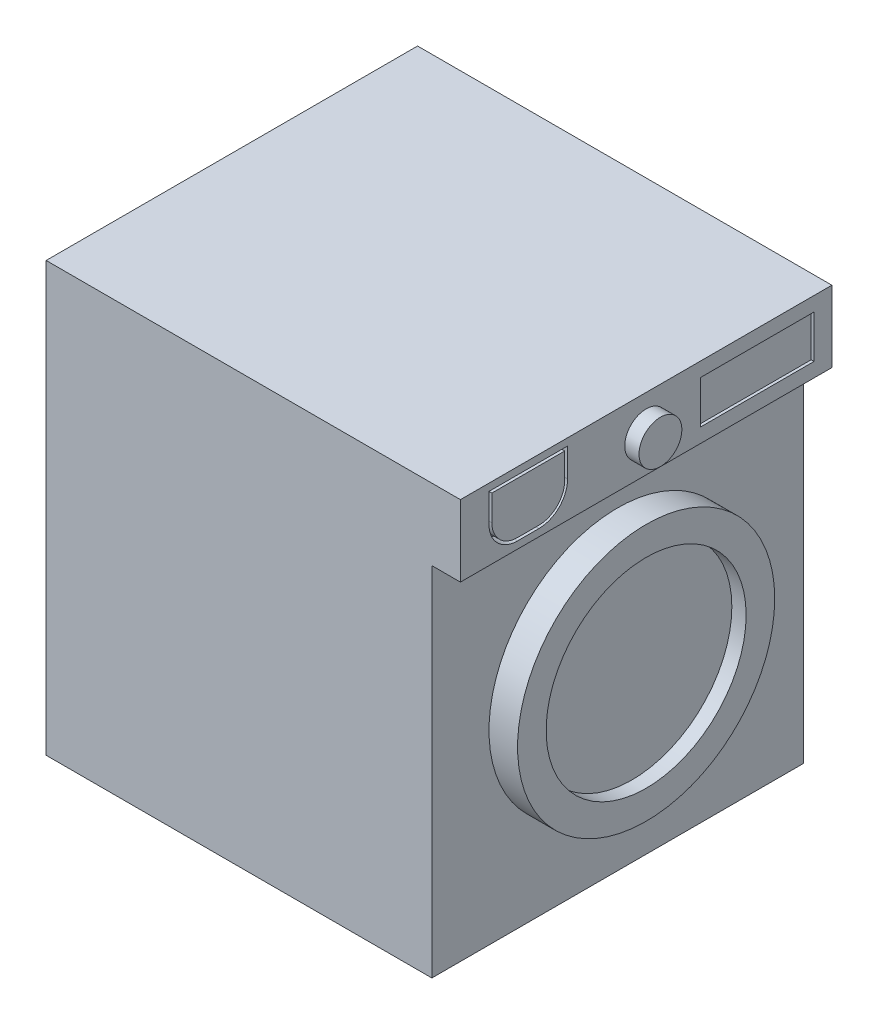
ISO-10303-21;
HEADER;
FILE_DESCRIPTION(('STEP AP214'),'2;1');
FILE_NAME('part.step','',(''),(''),'','','');
FILE_SCHEMA(('AUTOMOTIVE_DESIGN { 1 0 10303 214 1 1 1 1 }'));
ENDSEC;
DATA;
#1=APPLICATION_CONTEXT('core data for automotive mechanical design processes');
#2=APPLICATION_PROTOCOL_DEFINITION('international standard','automotive_design',2000,#1);
#3=PRODUCT_CONTEXT('',#1,'mechanical');
#4=PRODUCT('Part','Part','',(#3));
#5=PRODUCT_RELATED_PRODUCT_CATEGORY('part','',(#4));
#6=PRODUCT_DEFINITION_FORMATION('','',#4);
#7=PRODUCT_DEFINITION_CONTEXT('part definition',#1,'design');
#8=PRODUCT_DEFINITION('design','',#6,#7);
#9=PRODUCT_DEFINITION_SHAPE('','',#8);
#10=(LENGTH_UNIT() NAMED_UNIT(*) SI_UNIT(.MILLI.,.METRE.));
#11=(NAMED_UNIT(*) PLANE_ANGLE_UNIT() SI_UNIT($,.RADIAN.));
#12=(NAMED_UNIT(*) SI_UNIT($,.STERADIAN.) SOLID_ANGLE_UNIT());
#13=UNCERTAINTY_MEASURE_WITH_UNIT(LENGTH_MEASURE(1.E-05),#10,'distance_accuracy_value','');
#14=(GEOMETRIC_REPRESENTATION_CONTEXT(3) GLOBAL_UNCERTAINTY_ASSIGNED_CONTEXT((#13)) GLOBAL_UNIT_ASSIGNED_CONTEXT((#10,
#11,#12)) REPRESENTATION_CONTEXT('',''));
#15=CARTESIAN_POINT('',(0.,0.,0.));
#16=DIRECTION('',(0.,0.,1.));
#17=DIRECTION('',(1.,0.,0.));
#18=AXIS2_PLACEMENT_3D('',#15,#16,#17);
#19=CARTESIAN_POINT('',(-17.75,32.,60.));
#20=DIRECTION('',(-1.,0.,0.));
#21=DIRECTION('',(0.,0.,1.));
#22=AXIS2_PLACEMENT_3D('',#19,#20,#21);
#23=PLANE('',#22);
#24=CARTESIAN_POINT('',(-17.75,15.,47.));
#25=DIRECTION('',(1.,0.,0.));
#26=DIRECTION('',(0.,0.,-1.));
#27=AXIS2_PLACEMENT_3D('',#24,#25,#26);
#28=CIRCLE('',#27,9.);
#29=CARTESIAN_POINT('',(-17.75,15.,38.));
#30=VERTEX_POINT('',#29);
#31=EDGE_CURVE('E11',#30,#30,#28,.T.);
#32=ORIENTED_EDGE('',*,*,#31,.F.);
#33=EDGE_LOOP('',(#32));
#34=FACE_BOUND('',#33,.T.);
#35=DIRECTION('',(0.,0.,-1.));
#36=VECTOR('',#35,1.);
#37=CARTESIAN_POINT('',(-17.75,27.,60.));
#38=LINE('',#37,#36);
#39=CARTESIAN_POINT('',(-17.75,27.,60.));
#40=VERTEX_POINT('',#39);
#41=CARTESIAN_POINT('',(-17.75,27.,34.));
#42=VERTEX_POINT('',#41);
#43=EDGE_CURVE('E320',#40,#42,#38,.T.);
#44=ORIENTED_EDGE('',*,*,#43,.F.);
#45=DIRECTION('',(0.,-1.,0.));
#46=VECTOR('',#45,1.);
#47=CARTESIAN_POINT('',(-17.75,32.,60.));
#48=LINE('',#47,#46);
#49=CARTESIAN_POINT('',(-17.75,2.,60.));
#50=VERTEX_POINT('',#49);
#51=EDGE_CURVE('E372',#40,#50,#48,.T.);
#52=ORIENTED_EDGE('',*,*,#51,.T.);
#53=DIRECTION('',(0.,0.,-1.));
#54=VECTOR('',#53,1.);
#55=CARTESIAN_POINT('',(-17.75,2.,60.));
#56=LINE('',#55,#54);
#57=CARTESIAN_POINT('',(-17.75,2.,34.));
#58=VERTEX_POINT('',#57);
#59=EDGE_CURVE('E370',#50,#58,#56,.T.);
#60=ORIENTED_EDGE('',*,*,#59,.T.);
#61=DIRECTION('',(0.,-1.,0.));
#62=VECTOR('',#61,1.);
#63=CARTESIAN_POINT('',(-17.75,0.,34.));
#64=LINE('',#63,#62);
#65=EDGE_CURVE('E355',#42,#58,#64,.T.);
#66=ORIENTED_EDGE('',*,*,#65,.F.);
#67=EDGE_LOOP('',(#44,#52,#60,#66));
#68=FACE_BOUND('',#67,.T.);
#69=ADVANCED_FACE('F40',(#34,#68),#23,.F.);
#70=CARTESIAN_POINT('',(-44.75,32.,60.));
#71=DIRECTION('',(0.,0.,-1.));
#72=DIRECTION('',(-1.,0.,0.));
#73=AXIS2_PLACEMENT_3D('',#70,#71,#72);
#74=PLANE('',#73);
#75=DIRECTION('',(1.,0.,0.));
#76=VECTOR('',#75,1.);
#77=CARTESIAN_POINT('',(-44.75,2.,60.));
#78=LINE('',#77,#76);
#79=CARTESIAN_POINT('',(-44.75,2.,60.));
#80=VERTEX_POINT('',#79);
#81=EDGE_CURVE('E374',#80,#50,#78,.T.);
#82=ORIENTED_EDGE('',*,*,#81,.T.);
#83=ORIENTED_EDGE('',*,*,#51,.F.);
#84=DIRECTION('',(-1.,0.,0.));
#85=VECTOR('',#84,1.);
#86=CARTESIAN_POINT('',(-15.75,27.,60.));
#87=LINE('',#86,#85);
#88=CARTESIAN_POINT('',(-15.75,27.,60.));
#89=VERTEX_POINT('',#88);
#90=EDGE_CURVE('E345',#89,#40,#87,.T.);
#91=ORIENTED_EDGE('',*,*,#90,.F.);
#92=DIRECTION('',(0.,-1.,0.));
#93=VECTOR('',#92,1.);
#94=CARTESIAN_POINT('',(-15.75,32.,60.));
#95=LINE('',#94,#93);
#96=CARTESIAN_POINT('',(-15.75,32.,60.));
#97=VERTEX_POINT('',#96);
#98=EDGE_CURVE('E330',#97,#89,#95,.T.);
#99=ORIENTED_EDGE('',*,*,#98,.F.);
#100=DIRECTION('',(1.,0.,0.));
#101=VECTOR('',#100,1.);
#102=CARTESIAN_POINT('',(-44.75,32.,60.));
#103=LINE('',#102,#101);
#104=CARTESIAN_POINT('',(-44.75,32.,60.));
#105=VERTEX_POINT('',#104);
#106=EDGE_CURVE('E369',#105,#97,#103,.T.);
#107=ORIENTED_EDGE('',*,*,#106,.F.);
#108=DIRECTION('',(0.,-1.,0.));
#109=VECTOR('',#108,1.);
#110=CARTESIAN_POINT('',(-44.75,32.,60.));
#111=LINE('',#110,#109);
#112=EDGE_CURVE('E44',#105,#80,#111,.T.);
#113=ORIENTED_EDGE('',*,*,#112,.T.);
#114=EDGE_LOOP('',(#82,#83,#91,#99,#107,#113));
#115=FACE_BOUND('',#114,.T.);
#116=ADVANCED_FACE('F385',(#115),#74,.F.);
#117=CARTESIAN_POINT('',(0.,32.,0.));
#118=DIRECTION('',(0.,-1.,0.));
#119=DIRECTION('',(0.,0.,-1.));
#120=AXIS2_PLACEMENT_3D('',#117,#118,#119);
#121=PLANE('',#120);
#122=ORIENTED_EDGE('',*,*,#106,.T.);
#123=DIRECTION('',(0.,0.,1.));
#124=VECTOR('',#123,1.);
#125=CARTESIAN_POINT('',(-15.75,32.,60.));
#126=LINE('',#125,#124);
#127=CARTESIAN_POINT('',(-15.75,32.,34.));
#128=VERTEX_POINT('',#127);
#129=EDGE_CURVE('E338',#128,#97,#126,.T.);
#130=ORIENTED_EDGE('',*,*,#129,.F.);
#131=DIRECTION('',(1.,0.,0.));
#132=VECTOR('',#131,1.);
#133=CARTESIAN_POINT('',(-74.754166377355,32.,34.));
#134=LINE('',#133,#132);
#135=CARTESIAN_POINT('',(-44.75,32.,34.));
#136=VERTEX_POINT('',#135);
#137=EDGE_CURVE('E358',#136,#128,#134,.T.);
#138=ORIENTED_EDGE('',*,*,#137,.F.);
#139=DIRECTION('',(0.,0.,1.));
#140=VECTOR('',#139,1.);
#141=CARTESIAN_POINT('',(-44.75,32.,60.));
#142=LINE('',#141,#140);
#143=EDGE_CURVE('E367',#136,#105,#142,.T.);
#144=ORIENTED_EDGE('',*,*,#143,.T.);
#145=EDGE_LOOP('',(#122,#130,#138,#144));
#146=FACE_BOUND('',#145,.T.);
#147=ADVANCED_FACE('F407',(#146),#121,.F.);
#148=CARTESIAN_POINT('',(0.,2.,0.));
#149=DIRECTION('',(0.,-1.,0.));
#150=DIRECTION('',(0.,0.,-1.));
#151=AXIS2_PLACEMENT_3D('',#148,#149,#150);
#152=PLANE('',#151);
#153=DIRECTION('',(1.,0.,0.));
#154=VECTOR('',#153,1.);
#155=CARTESIAN_POINT('',(-74.754166377355,2.,34.));
#156=LINE('',#155,#154);
#157=CARTESIAN_POINT('',(-44.75,2.,34.));
#158=VERTEX_POINT('',#157);
#159=EDGE_CURVE('E362',#158,#58,#156,.T.);
#160=ORIENTED_EDGE('',*,*,#159,.T.);
#161=ORIENTED_EDGE('',*,*,#59,.F.);
#162=ORIENTED_EDGE('',*,*,#81,.F.);
#163=DIRECTION('',(0.,0.,1.));
#164=VECTOR('',#163,1.);
#165=CARTESIAN_POINT('',(-44.75,2.,60.));
#166=LINE('',#165,#164);
#167=EDGE_CURVE('E365',#158,#80,#166,.T.);
#168=ORIENTED_EDGE('',*,*,#167,.F.);
#169=EDGE_LOOP('',(#160,#161,#162,#168));
#170=FACE_BOUND('',#169,.T.);
#171=ADVANCED_FACE('F393',(#170),#152,.T.);
#172=CARTESIAN_POINT('',(-44.75,32.,60.));
#173=DIRECTION('',(1.,0.,0.));
#174=DIRECTION('',(0.,0.,-1.));
#175=AXIS2_PLACEMENT_3D('',#172,#173,#174);
#176=PLANE('',#175);
#177=ORIENTED_EDGE('',*,*,#143,.F.);
#178=DIRECTION('',(0.,-1.,0.));
#179=VECTOR('',#178,1.);
#180=CARTESIAN_POINT('',(-44.75,0.,34.));
#181=LINE('',#180,#179);
#182=EDGE_CURVE('E359',#136,#158,#181,.T.);
#183=ORIENTED_EDGE('',*,*,#182,.T.);
#184=ORIENTED_EDGE('',*,*,#167,.T.);
#185=ORIENTED_EDGE('',*,*,#112,.F.);
#186=EDGE_LOOP('',(#177,#183,#184,#185));
#187=FACE_BOUND('',#186,.T.);
#188=ADVANCED_FACE('F42',(#187),#176,.F.);
#189=CARTESIAN_POINT('',(-74.754166377355,0.,34.));
#190=DIRECTION('',(0.,0.,1.));
#191=DIRECTION('',(1.,0.,0.));
#192=AXIS2_PLACEMENT_3D('',#189,#190,#191);
#193=PLANE('',#192);
#194=ORIENTED_EDGE('',*,*,#137,.T.);
#195=DIRECTION('',(0.,1.,0.));
#196=VECTOR('',#195,1.);
#197=CARTESIAN_POINT('',(-15.75,32.,34.));
#198=LINE('',#197,#196);
#199=CARTESIAN_POINT('',(-15.75,27.,34.));
#200=VERTEX_POINT('',#199);
#201=EDGE_CURVE('E335',#200,#128,#198,.T.);
#202=ORIENTED_EDGE('',*,*,#201,.F.);
#203=DIRECTION('',(-1.,0.,0.));
#204=VECTOR('',#203,1.);
#205=CARTESIAN_POINT('',(-15.75,27.,34.));
#206=LINE('',#205,#204);
#207=EDGE_CURVE('E341',#200,#42,#206,.T.);
#208=ORIENTED_EDGE('',*,*,#207,.T.);
#209=ORIENTED_EDGE('',*,*,#65,.T.);
#210=ORIENTED_EDGE('',*,*,#159,.F.);
#211=ORIENTED_EDGE('',*,*,#182,.F.);
#212=EDGE_LOOP('',(#194,#202,#208,#209,#210,#211));
#213=FACE_BOUND('',#212,.T.);
#214=ADVANCED_FACE('F396',(#213),#193,.F.);
#215=CARTESIAN_POINT('',(-15.75,15.,47.));
#216=DIRECTION('',(-1.,0.,0.));
#217=DIRECTION('',(0.,0.,1.));
#218=AXIS2_PLACEMENT_3D('',#215,#216,#217);
#219=CYLINDRICAL_SURFACE('',#218,9.);
#220=CARTESIAN_POINT('',(-15.75,15.,47.));
#221=DIRECTION('',(1.,0.,0.));
#222=DIRECTION('',(0.,0.,-1.));
#223=AXIS2_PLACEMENT_3D('',#220,#221,#222);
#224=CIRCLE('',#223,9.);
#225=CARTESIAN_POINT('',(-15.75,15.,38.));
#226=VERTEX_POINT('',#225);
#227=EDGE_CURVE('E351',#226,#226,#224,.T.);
#228=ORIENTED_EDGE('',*,*,#227,.F.);
#229=EDGE_LOOP('',(#228));
#230=FACE_BOUND('',#229,.T.);
#231=ORIENTED_EDGE('',*,*,#31,.T.);
#232=EDGE_LOOP('',(#231));
#233=FACE_BOUND('',#232,.T.);
#234=ADVANCED_FACE('F423',(#230,#233),#219,.T.);
#235=CARTESIAN_POINT('',(-15.75,15.,47.));
#236=DIRECTION('',(1.,0.,0.));
#237=DIRECTION('',(0.,0.,-1.));
#238=AXIS2_PLACEMENT_3D('',#235,#236,#237);
#239=PLANE('',#238);
#240=CARTESIAN_POINT('',(-15.75,15.,47.));
#241=DIRECTION('',(1.,0.,0.));
#242=DIRECTION('',(0.,0.,-1.));
#243=AXIS2_PLACEMENT_3D('',#240,#241,#242);
#244=CIRCLE('',#243,7.);
#245=CARTESIAN_POINT('',(-15.75,15.,40.));
#246=VERTEX_POINT('',#245);
#247=EDGE_CURVE('E347',#246,#246,#244,.T.);
#248=ORIENTED_EDGE('',*,*,#247,.F.);
#249=EDGE_LOOP('',(#248));
#250=FACE_BOUND('',#249,.T.);
#251=ORIENTED_EDGE('',*,*,#227,.T.);
#252=EDGE_LOOP('',(#251));
#253=FACE_BOUND('',#252,.T.);
#254=ADVANCED_FACE('F425',(#250,#253),#239,.T.);
#255=CARTESIAN_POINT('',(-16.75,15.,47.));
#256=DIRECTION('',(1.,0.,0.));
#257=DIRECTION('',(0.,0.,-1.));
#258=AXIS2_PLACEMENT_3D('',#255,#256,#257);
#259=CYLINDRICAL_SURFACE('',#258,7.);
#260=CARTESIAN_POINT('',(-16.75,15.,47.));
#261=DIRECTION('',(1.,0.,0.));
#262=DIRECTION('',(0.,0.,-1.));
#263=AXIS2_PLACEMENT_3D('',#260,#261,#262);
#264=CIRCLE('',#263,7.);
#265=CARTESIAN_POINT('',(-16.75,15.,40.));
#266=VERTEX_POINT('',#265);
#267=EDGE_CURVE('E348',#266,#266,#264,.T.);
#268=ORIENTED_EDGE('',*,*,#267,.F.);
#269=EDGE_LOOP('',(#268));
#270=FACE_BOUND('',#269,.T.);
#271=ORIENTED_EDGE('',*,*,#247,.T.);
#272=EDGE_LOOP('',(#271));
#273=FACE_BOUND('',#272,.T.);
#274=ADVANCED_FACE('F432',(#270,#273),#259,.F.);
#275=CARTESIAN_POINT('',(-16.75,15.,47.));
#276=DIRECTION('',(1.,0.,0.));
#277=DIRECTION('',(0.,0.,-1.));
#278=AXIS2_PLACEMENT_3D('',#275,#276,#277);
#279=PLANE('',#278);
#280=ORIENTED_EDGE('',*,*,#267,.T.);
#281=EDGE_LOOP('',(#280));
#282=FACE_BOUND('',#281,.T.);
#283=ADVANCED_FACE('F439',(#282),#279,.T.);
#284=CARTESIAN_POINT('',(-15.75,27.,60.));
#285=DIRECTION('',(0.,1.,0.));
#286=DIRECTION('',(0.,0.,1.));
#287=AXIS2_PLACEMENT_3D('',#284,#285,#286);
#288=PLANE('',#287);
#289=ORIENTED_EDGE('',*,*,#43,.T.);
#290=ORIENTED_EDGE('',*,*,#207,.F.);
#291=DIRECTION('',(0.,0.,-1.));
#292=VECTOR('',#291,1.);
#293=CARTESIAN_POINT('',(-15.75,27.,60.));
#294=LINE('',#293,#292);
#295=EDGE_CURVE('E333',#89,#200,#294,.T.);
#296=ORIENTED_EDGE('',*,*,#295,.F.);
#297=ORIENTED_EDGE('',*,*,#90,.T.);
#298=EDGE_LOOP('',(#289,#290,#296,#297));
#299=FACE_BOUND('',#298,.T.);
#300=ADVANCED_FACE('F400',(#299),#288,.F.);
#301=CARTESIAN_POINT('',(-15.75,0.,0.));
#302=DIRECTION('',(1.,0.,0.));
#303=DIRECTION('',(0.,0.,-1.));
#304=AXIS2_PLACEMENT_3D('',#301,#302,#303);
#305=PLANE('',#304);
#306=DIRECTION('',(0.,-1.,0.));
#307=VECTOR('',#306,1.);
#308=CARTESIAN_POINT('',(-15.75,31.,43.1972781766812));
#309=LINE('',#308,#307);
#310=CARTESIAN_POINT('',(-15.75,31.,43.1972781766812));
#311=VERTEX_POINT('',#310);
#312=CARTESIAN_POINT('',(-15.75,28.,43.1972781766812));
#313=VERTEX_POINT('',#312);
#314=EDGE_CURVE('E56',#311,#313,#309,.T.);
#315=ORIENTED_EDGE('',*,*,#314,.F.);
#316=DIRECTION('',(0.,0.,1.));
#317=VECTOR('',#316,1.);
#318=CARTESIAN_POINT('',(-15.75,31.,43.1972781766812));
#319=LINE('',#318,#317);
#320=CARTESIAN_POINT('',(-15.75,31.,35.2483630656139));
#321=VERTEX_POINT('',#320);
#322=EDGE_CURVE('E210',#321,#311,#319,.T.);
#323=ORIENTED_EDGE('',*,*,#322,.F.);
#324=DIRECTION('',(0.,1.,0.));
#325=VECTOR('',#324,1.);
#326=CARTESIAN_POINT('',(-15.75,31.,35.2483630656139));
#327=LINE('',#326,#325);
#328=CARTESIAN_POINT('',(-15.75,28.,35.2483630656139));
#329=VERTEX_POINT('',#328);
#330=EDGE_CURVE('E213',#329,#321,#327,.T.);
#331=ORIENTED_EDGE('',*,*,#330,.F.);
#332=DIRECTION('',(0.,0.,-1.));
#333=VECTOR('',#332,1.);
#334=CARTESIAN_POINT('',(-15.75,28.,43.1972781766812));
#335=LINE('',#334,#333);
#336=EDGE_CURVE('E219',#313,#329,#335,.T.);
#337=ORIENTED_EDGE('',*,*,#336,.F.);
#338=EDGE_LOOP('',(#315,#323,#331,#337));
#339=FACE_BOUND('',#338,.T.);
#340=CARTESIAN_POINT('',(-15.75,29.5,47.));
#341=DIRECTION('',(1.,0.,0.));
#342=DIRECTION('',(0.,0.,-1.));
#343=AXIS2_PLACEMENT_3D('',#340,#341,#342);
#344=CIRCLE('',#343,1.5);
#345=CARTESIAN_POINT('',(-15.75,29.5,45.5));
#346=VERTEX_POINT('',#345);
#347=EDGE_CURVE('E225',#346,#346,#344,.T.);
#348=ORIENTED_EDGE('',*,*,#347,.F.);
#349=EDGE_LOOP('',(#348));
#350=FACE_BOUND('',#349,.T.);
#351=DIRECTION('',(0.,-1.,0.));
#352=VECTOR('',#351,1.);
#353=CARTESIAN_POINT('',(-15.75,31.5,58.));
#354=LINE('',#353,#352);
#355=CARTESIAN_POINT('',(-15.75,31.5,58.));
#356=VERTEX_POINT('',#355);
#357=CARTESIAN_POINT('',(-15.75,29.5,58.));
#358=VERTEX_POINT('',#357);
#359=EDGE_CURVE('E64',#356,#358,#354,.T.);
#360=ORIENTED_EDGE('',*,*,#359,.F.);
#361=DIRECTION('',(0.,0.,1.));
#362=VECTOR('',#361,1.);
#363=CARTESIAN_POINT('',(-15.75,31.5,58.));
#364=LINE('',#363,#362);
#365=CARTESIAN_POINT('',(-15.75,31.5,52.5));
#366=VERTEX_POINT('',#365);
#367=EDGE_CURVE('E287',#366,#356,#364,.T.);
#368=ORIENTED_EDGE('',*,*,#367,.F.);
#369=DIRECTION('',(0.,1.,0.));
#370=VECTOR('',#369,1.);
#371=CARTESIAN_POINT('',(-15.75,31.5,52.5));
#372=LINE('',#371,#370);
#373=CARTESIAN_POINT('',(-15.75,29.5,52.5));
#374=VERTEX_POINT('',#373);
#375=EDGE_CURVE('E313',#374,#366,#372,.T.);
#376=ORIENTED_EDGE('',*,*,#375,.F.);
#377=CARTESIAN_POINT('',(-15.75,29.5,54.5));
#378=DIRECTION('',(1.,0.,0.));
#379=DIRECTION('',(0.,0.,-1.));
#380=AXIS2_PLACEMENT_3D('',#377,#378,#379);
#381=CIRCLE('',#380,2.);
#382=CARTESIAN_POINT('',(-15.75,27.5,54.5));
#383=VERTEX_POINT('',#382);
#384=EDGE_CURVE('E310',#383,#374,#381,.T.);
#385=ORIENTED_EDGE('',*,*,#384,.F.);
#386=DIRECTION('',(0.,0.,-1.));
#387=VECTOR('',#386,1.);
#388=CARTESIAN_POINT('',(-15.75,27.5,56.));
#389=LINE('',#388,#387);
#390=CARTESIAN_POINT('',(-15.75,27.5,56.));
#391=VERTEX_POINT('',#390);
#392=EDGE_CURVE('E307',#391,#383,#389,.T.);
#393=ORIENTED_EDGE('',*,*,#392,.F.);
#394=CARTESIAN_POINT('',(-15.75,29.5,56.));
#395=DIRECTION('',(1.,0.,0.));
#396=DIRECTION('',(0.,0.,1.));
#397=AXIS2_PLACEMENT_3D('',#394,#395,#396);
#398=CIRCLE('',#397,2.);
#399=EDGE_CURVE('E304',#358,#391,#398,.T.);
#400=ORIENTED_EDGE('',*,*,#399,.F.);
#401=EDGE_LOOP('',(#360,#368,#376,#385,#393,#400));
#402=FACE_BOUND('',#401,.T.);
#403=ORIENTED_EDGE('',*,*,#98,.T.);
#404=ORIENTED_EDGE('',*,*,#295,.T.);
#405=ORIENTED_EDGE('',*,*,#201,.T.);
#406=ORIENTED_EDGE('',*,*,#129,.T.);
#407=EDGE_LOOP('',(#403,#404,#405,#406));
#408=FACE_BOUND('',#407,.T.);
#409=ADVANCED_FACE('F403',(#339,#350,#402,#408),#305,.T.);
#410=CARTESIAN_POINT('',(-16.75,31.5,58.));
#411=DIRECTION('',(0.,0.,1.));
#412=DIRECTION('',(1.,0.,0.));
#413=AXIS2_PLACEMENT_3D('',#410,#411,#412);
#414=PLANE('',#413);
#415=ORIENTED_EDGE('',*,*,#359,.T.);
#416=DIRECTION('',(1.,0.,0.));
#417=VECTOR('',#416,1.);
#418=CARTESIAN_POINT('',(-16.75,29.5,58.));
#419=LINE('',#418,#417);
#420=CARTESIAN_POINT('',(-16.75,29.5,58.));
#421=VERTEX_POINT('',#420);
#422=EDGE_CURVE('E302',#421,#358,#419,.T.);
#423=ORIENTED_EDGE('',*,*,#422,.F.);
#424=DIRECTION('',(0.,-1.,0.));
#425=VECTOR('',#424,1.);
#426=CARTESIAN_POINT('',(-16.75,31.5,58.));
#427=LINE('',#426,#425);
#428=CARTESIAN_POINT('',(-16.75,31.5,58.));
#429=VERTEX_POINT('',#428);
#430=EDGE_CURVE('E283',#429,#421,#427,.T.);
#431=ORIENTED_EDGE('',*,*,#430,.F.);
#432=DIRECTION('',(1.,0.,0.));
#433=VECTOR('',#432,1.);
#434=CARTESIAN_POINT('',(-16.75,31.5,58.));
#435=LINE('',#434,#433);
#436=EDGE_CURVE('E318',#429,#356,#435,.T.);
#437=ORIENTED_EDGE('',*,*,#436,.T.);
#438=EDGE_LOOP('',(#415,#423,#431,#437));
#439=FACE_BOUND('',#438,.T.);
#440=ADVANCED_FACE('F448',(#439),#414,.F.);
#441=CARTESIAN_POINT('',(-16.75,31.5,58.));
#442=DIRECTION('',(0.,1.,0.));
#443=DIRECTION('',(0.,0.,1.));
#444=AXIS2_PLACEMENT_3D('',#441,#442,#443);
#445=PLANE('',#444);
#446=ORIENTED_EDGE('',*,*,#367,.T.);
#447=ORIENTED_EDGE('',*,*,#436,.F.);
#448=DIRECTION('',(0.,0.,1.));
#449=VECTOR('',#448,1.);
#450=CARTESIAN_POINT('',(-16.75,31.5,58.));
#451=LINE('',#450,#449);
#452=CARTESIAN_POINT('',(-16.75,31.5,52.5));
#453=VERTEX_POINT('',#452);
#454=EDGE_CURVE('E299',#453,#429,#451,.T.);
#455=ORIENTED_EDGE('',*,*,#454,.F.);
#456=DIRECTION('',(1.,0.,0.));
#457=VECTOR('',#456,1.);
#458=CARTESIAN_POINT('',(-16.75,31.5,52.5));
#459=LINE('',#458,#457);
#460=EDGE_CURVE('E321',#453,#366,#459,.T.);
#461=ORIENTED_EDGE('',*,*,#460,.T.);
#462=EDGE_LOOP('',(#446,#447,#455,#461));
#463=FACE_BOUND('',#462,.T.);
#464=ADVANCED_FACE('F453',(#463),#445,.F.);
#465=CARTESIAN_POINT('',(-16.75,31.5,52.5));
#466=DIRECTION('',(0.,0.,-1.));
#467=DIRECTION('',(0.,1.,0.));
#468=AXIS2_PLACEMENT_3D('',#465,#466,#467);
#469=PLANE('',#468);
#470=ORIENTED_EDGE('',*,*,#375,.T.);
#471=ORIENTED_EDGE('',*,*,#460,.F.);
#472=DIRECTION('',(0.,1.,0.));
#473=VECTOR('',#472,1.);
#474=CARTESIAN_POINT('',(-16.75,31.5,52.5));
#475=LINE('',#474,#473);
#476=CARTESIAN_POINT('',(-16.75,29.5,52.5));
#477=VERTEX_POINT('',#476);
#478=EDGE_CURVE('E296',#477,#453,#475,.T.);
#479=ORIENTED_EDGE('',*,*,#478,.F.);
#480=DIRECTION('',(1.,0.,0.));
#481=VECTOR('',#480,1.);
#482=CARTESIAN_POINT('',(-16.75,29.5,52.5));
#483=LINE('',#482,#481);
#484=EDGE_CURVE('E323',#477,#374,#483,.T.);
#485=ORIENTED_EDGE('',*,*,#484,.T.);
#486=EDGE_LOOP('',(#470,#471,#479,#485));
#487=FACE_BOUND('',#486,.T.);
#488=ADVANCED_FACE('F466',(#487),#469,.F.);
#489=CARTESIAN_POINT('',(-16.75,29.5,54.5));
#490=DIRECTION('',(1.,0.,0.));
#491=DIRECTION('',(0.,0.,-1.));
#492=AXIS2_PLACEMENT_3D('',#489,#490,#491);
#493=CYLINDRICAL_SURFACE('',#492,2.);
#494=ORIENTED_EDGE('',*,*,#384,.T.);
#495=ORIENTED_EDGE('',*,*,#484,.F.);
#496=CARTESIAN_POINT('',(-16.75,29.5,54.5));
#497=DIRECTION('',(1.,0.,0.));
#498=DIRECTION('',(0.,0.,-1.));
#499=AXIS2_PLACEMENT_3D('',#496,#497,#498);
#500=CIRCLE('',#499,2.);
#501=CARTESIAN_POINT('',(-16.75,27.5,54.5));
#502=VERTEX_POINT('',#501);
#503=EDGE_CURVE('E293',#502,#477,#500,.T.);
#504=ORIENTED_EDGE('',*,*,#503,.F.);
#505=DIRECTION('',(1.,0.,0.));
#506=VECTOR('',#505,1.);
#507=CARTESIAN_POINT('',(-16.75,27.5,54.5));
#508=LINE('',#507,#506);
#509=EDGE_CURVE('E325',#502,#383,#508,.T.);
#510=ORIENTED_EDGE('',*,*,#509,.T.);
#511=EDGE_LOOP('',(#494,#495,#504,#510));
#512=FACE_BOUND('',#511,.T.);
#513=ADVANCED_FACE('F462',(#512),#493,.F.);
#514=CARTESIAN_POINT('',(-16.75,27.5,56.));
#515=DIRECTION('',(0.,-1.,0.));
#516=DIRECTION('',(0.,0.,-1.));
#517=AXIS2_PLACEMENT_3D('',#514,#515,#516);
#518=PLANE('',#517);
#519=ORIENTED_EDGE('',*,*,#392,.T.);
#520=ORIENTED_EDGE('',*,*,#509,.F.);
#521=DIRECTION('',(0.,0.,-1.));
#522=VECTOR('',#521,1.);
#523=CARTESIAN_POINT('',(-16.75,27.5,56.));
#524=LINE('',#523,#522);
#525=CARTESIAN_POINT('',(-16.75,27.5,56.));
#526=VERTEX_POINT('',#525);
#527=EDGE_CURVE('E290',#526,#502,#524,.T.);
#528=ORIENTED_EDGE('',*,*,#527,.F.);
#529=DIRECTION('',(1.,0.,0.));
#530=VECTOR('',#529,1.);
#531=CARTESIAN_POINT('',(-16.75,27.5,56.));
#532=LINE('',#531,#530);
#533=EDGE_CURVE('E327',#526,#391,#532,.T.);
#534=ORIENTED_EDGE('',*,*,#533,.T.);
#535=EDGE_LOOP('',(#519,#520,#528,#534));
#536=FACE_BOUND('',#535,.T.);
#537=ADVANCED_FACE('F458',(#536),#518,.F.);
#538=CARTESIAN_POINT('',(-16.75,29.5,56.));
#539=DIRECTION('',(1.,0.,0.));
#540=DIRECTION('',(0.,0.,-1.));
#541=AXIS2_PLACEMENT_3D('',#538,#539,#540);
#542=CYLINDRICAL_SURFACE('',#541,2.);
#543=ORIENTED_EDGE('',*,*,#399,.T.);
#544=ORIENTED_EDGE('',*,*,#533,.F.);
#545=CARTESIAN_POINT('',(-16.75,29.5,56.));
#546=DIRECTION('',(1.,0.,0.));
#547=DIRECTION('',(0.,0.,1.));
#548=AXIS2_PLACEMENT_3D('',#545,#546,#547);
#549=CIRCLE('',#548,2.);
#550=EDGE_CURVE('E286',#421,#526,#549,.T.);
#551=ORIENTED_EDGE('',*,*,#550,.F.);
#552=ORIENTED_EDGE('',*,*,#422,.T.);
#553=EDGE_LOOP('',(#543,#544,#551,#552));
#554=FACE_BOUND('',#553,.T.);
#555=ADVANCED_FACE('F454',(#554),#542,.F.);
#556=CARTESIAN_POINT('',(-16.75,29.5,56.));
#557=DIRECTION('',(-1.,0.,0.));
#558=DIRECTION('',(0.,0.,1.));
#559=AXIS2_PLACEMENT_3D('',#556,#557,#558);
#560=PLANE('',#559);
#561=DIRECTION('',(0.,-1.,0.));
#562=VECTOR('',#561,1.);
#563=CARTESIAN_POINT('',(-16.75,31.3,57.8));
#564=LINE('',#563,#562);
#565=CARTESIAN_POINT('',(-16.75,31.3,57.8));
#566=VERTEX_POINT('',#565);
#567=CARTESIAN_POINT('',(-16.75,29.5,57.8));
#568=VERTEX_POINT('',#567);
#569=EDGE_CURVE('E235',#566,#568,#564,.T.);
#570=ORIENTED_EDGE('',*,*,#569,.F.);
#571=DIRECTION('',(0.,0.,1.));
#572=VECTOR('',#571,1.);
#573=CARTESIAN_POINT('',(-16.75,31.3,57.8));
#574=LINE('',#573,#572);
#575=CARTESIAN_POINT('',(-16.75,31.3,52.7));
#576=VERTEX_POINT('',#575);
#577=EDGE_CURVE('E251',#576,#566,#574,.T.);
#578=ORIENTED_EDGE('',*,*,#577,.F.);
#579=DIRECTION('',(0.,1.,0.));
#580=VECTOR('',#579,1.);
#581=CARTESIAN_POINT('',(-16.75,31.3,52.7));
#582=LINE('',#581,#580);
#583=CARTESIAN_POINT('',(-16.75,29.5,52.7));
#584=VERTEX_POINT('',#583);
#585=EDGE_CURVE('E248',#584,#576,#582,.T.);
#586=ORIENTED_EDGE('',*,*,#585,.F.);
#587=CARTESIAN_POINT('',(-16.75,29.5,54.5));
#588=DIRECTION('',(1.,0.,0.));
#589=DIRECTION('',(0.,0.,-1.));
#590=AXIS2_PLACEMENT_3D('',#587,#588,#589);
#591=CIRCLE('',#590,1.8);
#592=CARTESIAN_POINT('',(-16.75,27.7,54.5));
#593=VERTEX_POINT('',#592);
#594=EDGE_CURVE('E245',#593,#584,#591,.T.);
#595=ORIENTED_EDGE('',*,*,#594,.F.);
#596=DIRECTION('',(0.,0.,-1.));
#597=VECTOR('',#596,1.);
#598=CARTESIAN_POINT('',(-16.75,27.7,56.));
#599=LINE('',#598,#597);
#600=CARTESIAN_POINT('',(-16.75,27.7,56.));
#601=VERTEX_POINT('',#600);
#602=EDGE_CURVE('E242',#601,#593,#599,.T.);
#603=ORIENTED_EDGE('',*,*,#602,.F.);
#604=CARTESIAN_POINT('',(-16.75,29.5,56.));
#605=DIRECTION('',(1.,0.,0.));
#606=DIRECTION('',(0.,0.,1.));
#607=AXIS2_PLACEMENT_3D('',#604,#605,#606);
#608=CIRCLE('',#607,1.8);
#609=EDGE_CURVE('E238',#568,#601,#608,.T.);
#610=ORIENTED_EDGE('',*,*,#609,.F.);
#611=EDGE_LOOP('',(#570,#578,#586,#595,#603,#610));
#612=FACE_BOUND('',#611,.T.);
#613=ORIENTED_EDGE('',*,*,#430,.T.);
#614=ORIENTED_EDGE('',*,*,#550,.T.);
#615=ORIENTED_EDGE('',*,*,#527,.T.);
#616=ORIENTED_EDGE('',*,*,#503,.T.);
#617=ORIENTED_EDGE('',*,*,#478,.T.);
#618=ORIENTED_EDGE('',*,*,#454,.T.);
#619=EDGE_LOOP('',(#613,#614,#615,#616,#617,#618));
#620=FACE_BOUND('',#619,.T.);
#621=ADVANCED_FACE('F457',(#612,#620),#560,.F.);
#622=CARTESIAN_POINT('',(-16.75,31.3,57.8));
#623=DIRECTION('',(0.,0.,1.));
#624=DIRECTION('',(1.,0.,0.));
#625=AXIS2_PLACEMENT_3D('',#622,#623,#624);
#626=PLANE('',#625);
#627=DIRECTION('',(0.,-1.,0.));
#628=VECTOR('',#627,1.);
#629=CARTESIAN_POINT('',(-15.75,31.3,57.8));
#630=LINE('',#629,#628);
#631=CARTESIAN_POINT('',(-15.75,31.3,57.8));
#632=VERTEX_POINT('',#631);
#633=CARTESIAN_POINT('',(-15.75,29.5,57.8));
#634=VERTEX_POINT('',#633);
#635=EDGE_CURVE('E232',#632,#634,#630,.T.);
#636=ORIENTED_EDGE('',*,*,#635,.F.);
#637=DIRECTION('',(1.,0.,0.));
#638=VECTOR('',#637,1.);
#639=CARTESIAN_POINT('',(-16.75,31.3,57.8));
#640=LINE('',#639,#638);
#641=EDGE_CURVE('E271',#566,#632,#640,.T.);
#642=ORIENTED_EDGE('',*,*,#641,.F.);
#643=ORIENTED_EDGE('',*,*,#569,.T.);
#644=DIRECTION('',(1.,0.,0.));
#645=VECTOR('',#644,1.);
#646=CARTESIAN_POINT('',(-16.75,29.5,57.8));
#647=LINE('',#646,#645);
#648=EDGE_CURVE('E254',#568,#634,#647,.T.);
#649=ORIENTED_EDGE('',*,*,#648,.T.);
#650=EDGE_LOOP('',(#636,#642,#643,#649));
#651=FACE_BOUND('',#650,.T.);
#652=ADVANCED_FACE('F476',(#651),#626,.T.);
#653=CARTESIAN_POINT('',(-16.75,31.3,57.8));
#654=DIRECTION('',(0.,1.,0.));
#655=DIRECTION('',(0.,0.,1.));
#656=AXIS2_PLACEMENT_3D('',#653,#654,#655);
#657=PLANE('',#656);
#658=DIRECTION('',(0.,0.,1.));
#659=VECTOR('',#658,1.);
#660=CARTESIAN_POINT('',(-15.75,31.3,57.8));
#661=LINE('',#660,#659);
#662=CARTESIAN_POINT('',(-15.75,31.3,52.7));
#663=VERTEX_POINT('',#662);
#664=EDGE_CURVE('E239',#663,#632,#661,.T.);
#665=ORIENTED_EDGE('',*,*,#664,.F.);
#666=DIRECTION('',(1.,0.,0.));
#667=VECTOR('',#666,1.);
#668=CARTESIAN_POINT('',(-16.75,31.3,52.7));
#669=LINE('',#668,#667);
#670=EDGE_CURVE('E273',#576,#663,#669,.T.);
#671=ORIENTED_EDGE('',*,*,#670,.F.);
#672=ORIENTED_EDGE('',*,*,#577,.T.);
#673=ORIENTED_EDGE('',*,*,#641,.T.);
#674=EDGE_LOOP('',(#665,#671,#672,#673));
#675=FACE_BOUND('',#674,.T.);
#676=ADVANCED_FACE('F480',(#675),#657,.T.);
#677=CARTESIAN_POINT('',(-16.75,31.3,52.7));
#678=DIRECTION('',(0.,0.,-1.));
#679=DIRECTION('',(-1.,0.,0.));
#680=AXIS2_PLACEMENT_3D('',#677,#678,#679);
#681=PLANE('',#680);
#682=DIRECTION('',(0.,1.,0.));
#683=VECTOR('',#682,1.);
#684=CARTESIAN_POINT('',(-15.75,31.3,52.7));
#685=LINE('',#684,#683);
#686=CARTESIAN_POINT('',(-15.75,29.5,52.7));
#687=VERTEX_POINT('',#686);
#688=EDGE_CURVE('E266',#687,#663,#685,.T.);
#689=ORIENTED_EDGE('',*,*,#688,.F.);
#690=DIRECTION('',(1.,0.,0.));
#691=VECTOR('',#690,1.);
#692=CARTESIAN_POINT('',(-16.75,29.5,52.7));
#693=LINE('',#692,#691);
#694=EDGE_CURVE('E275',#584,#687,#693,.T.);
#695=ORIENTED_EDGE('',*,*,#694,.F.);
#696=ORIENTED_EDGE('',*,*,#585,.T.);
#697=ORIENTED_EDGE('',*,*,#670,.T.);
#698=EDGE_LOOP('',(#689,#695,#696,#697));
#699=FACE_BOUND('',#698,.T.);
#700=ADVANCED_FACE('F493',(#699),#681,.T.);
#701=CARTESIAN_POINT('',(-16.75,29.5,54.5));
#702=DIRECTION('',(1.,0.,0.));
#703=DIRECTION('',(0.,0.,-1.));
#704=AXIS2_PLACEMENT_3D('',#701,#702,#703);
#705=CYLINDRICAL_SURFACE('',#704,1.8);
#706=CARTESIAN_POINT('',(-15.75,29.5,54.5));
#707=DIRECTION('',(1.,0.,0.));
#708=DIRECTION('',(0.,0.,-1.));
#709=AXIS2_PLACEMENT_3D('',#706,#707,#708);
#710=CIRCLE('',#709,1.8);
#711=CARTESIAN_POINT('',(-15.75,27.7,54.5));
#712=VERTEX_POINT('',#711);
#713=EDGE_CURVE('E263',#712,#687,#710,.T.);
#714=ORIENTED_EDGE('',*,*,#713,.F.);
#715=DIRECTION('',(1.,0.,0.));
#716=VECTOR('',#715,1.);
#717=CARTESIAN_POINT('',(-16.75,27.7,54.5));
#718=LINE('',#717,#716);
#719=EDGE_CURVE('E277',#593,#712,#718,.T.);
#720=ORIENTED_EDGE('',*,*,#719,.F.);
#721=ORIENTED_EDGE('',*,*,#594,.T.);
#722=ORIENTED_EDGE('',*,*,#694,.T.);
#723=EDGE_LOOP('',(#714,#720,#721,#722));
#724=FACE_BOUND('',#723,.T.);
#725=ADVANCED_FACE('F489',(#724),#705,.T.);
#726=CARTESIAN_POINT('',(-16.75,27.7,56.));
#727=DIRECTION('',(0.,-1.,0.));
#728=DIRECTION('',(0.,0.,-1.));
#729=AXIS2_PLACEMENT_3D('',#726,#727,#728);
#730=PLANE('',#729);
#731=DIRECTION('',(0.,0.,-1.));
#732=VECTOR('',#731,1.);
#733=CARTESIAN_POINT('',(-15.75,27.7,56.));
#734=LINE('',#733,#732);
#735=CARTESIAN_POINT('',(-15.75,27.7,56.));
#736=VERTEX_POINT('',#735);
#737=EDGE_CURVE('E260',#736,#712,#734,.T.);
#738=ORIENTED_EDGE('',*,*,#737,.F.);
#739=DIRECTION('',(1.,0.,0.));
#740=VECTOR('',#739,1.);
#741=CARTESIAN_POINT('',(-16.75,27.7,56.));
#742=LINE('',#741,#740);
#743=EDGE_CURVE('E279',#601,#736,#742,.T.);
#744=ORIENTED_EDGE('',*,*,#743,.F.);
#745=ORIENTED_EDGE('',*,*,#602,.T.);
#746=ORIENTED_EDGE('',*,*,#719,.T.);
#747=EDGE_LOOP('',(#738,#744,#745,#746));
#748=FACE_BOUND('',#747,.T.);
#749=ADVANCED_FACE('F485',(#748),#730,.T.);
#750=CARTESIAN_POINT('',(-16.75,29.5,56.));
#751=DIRECTION('',(1.,0.,0.));
#752=DIRECTION('',(0.,0.,-1.));
#753=AXIS2_PLACEMENT_3D('',#750,#751,#752);
#754=CYLINDRICAL_SURFACE('',#753,1.8);
#755=CARTESIAN_POINT('',(-15.75,29.5,56.));
#756=DIRECTION('',(1.,0.,0.));
#757=DIRECTION('',(0.,0.,1.));
#758=AXIS2_PLACEMENT_3D('',#755,#756,#757);
#759=CIRCLE('',#758,1.8);
#760=EDGE_CURVE('E257',#634,#736,#759,.T.);
#761=ORIENTED_EDGE('',*,*,#760,.F.);
#762=ORIENTED_EDGE('',*,*,#648,.F.);
#763=ORIENTED_EDGE('',*,*,#609,.T.);
#764=ORIENTED_EDGE('',*,*,#743,.T.);
#765=EDGE_LOOP('',(#761,#762,#763,#764));
#766=FACE_BOUND('',#765,.T.);
#767=ADVANCED_FACE('F482',(#766),#754,.T.);
#768=ORIENTED_EDGE('',*,*,#664,.T.);
#769=ORIENTED_EDGE('',*,*,#635,.T.);
#770=ORIENTED_EDGE('',*,*,#760,.T.);
#771=ORIENTED_EDGE('',*,*,#737,.T.);
#772=ORIENTED_EDGE('',*,*,#713,.T.);
#773=ORIENTED_EDGE('',*,*,#688,.T.);
#774=EDGE_LOOP('',(#768,#769,#770,#771,#772,#773));
#775=FACE_BOUND('',#774,.T.);
#776=ADVANCED_FACE('F450',(#775),#305,.T.);
#777=CARTESIAN_POINT('',(-14.75,29.5,47.));
#778=DIRECTION('',(-1.,0.,0.));
#779=DIRECTION('',(0.,0.,1.));
#780=AXIS2_PLACEMENT_3D('',#777,#778,#779);
#781=CYLINDRICAL_SURFACE('',#780,1.5);
#782=CARTESIAN_POINT('',(-14.75,29.5,47.));
#783=DIRECTION('',(1.,0.,0.));
#784=DIRECTION('',(0.,0.,-1.));
#785=AXIS2_PLACEMENT_3D('',#782,#783,#784);
#786=CIRCLE('',#785,1.5);
#787=CARTESIAN_POINT('',(-14.75,29.5,45.5));
#788=VERTEX_POINT('',#787);
#789=EDGE_CURVE('E229',#788,#788,#786,.T.);
#790=ORIENTED_EDGE('',*,*,#789,.F.);
#791=EDGE_LOOP('',(#790));
#792=FACE_BOUND('',#791,.T.);
#793=ORIENTED_EDGE('',*,*,#347,.T.);
#794=EDGE_LOOP('',(#793));
#795=FACE_BOUND('',#794,.T.);
#796=ADVANCED_FACE('F501',(#792,#795),#781,.T.);
#797=CARTESIAN_POINT('',(-14.75,29.5,47.));
#798=DIRECTION('',(1.,0.,0.));
#799=DIRECTION('',(0.,0.,-1.));
#800=AXIS2_PLACEMENT_3D('',#797,#798,#799);
#801=PLANE('',#800);
#802=ORIENTED_EDGE('',*,*,#789,.T.);
#803=EDGE_LOOP('',(#802));
#804=FACE_BOUND('',#803,.T.);
#805=ADVANCED_FACE('F504',(#804),#801,.T.);
#806=CARTESIAN_POINT('',(-15.95,31.,43.1972781766812));
#807=DIRECTION('',(0.,0.,1.));
#808=DIRECTION('',(0.,-1.,0.));
#809=AXIS2_PLACEMENT_3D('',#806,#807,#808);
#810=PLANE('',#809);
#811=ORIENTED_EDGE('',*,*,#314,.T.);
#812=DIRECTION('',(1.,0.,0.));
#813=VECTOR('',#812,1.);
#814=CARTESIAN_POINT('',(-15.95,28.,43.1972781766812));
#815=LINE('',#814,#813);
#816=CARTESIAN_POINT('',(-15.95,28.,43.1972781766812));
#817=VERTEX_POINT('',#816);
#818=EDGE_CURVE('E188',#817,#313,#815,.T.);
#819=ORIENTED_EDGE('',*,*,#818,.F.);
#820=DIRECTION('',(0.,-1.,0.));
#821=VECTOR('',#820,1.);
#822=CARTESIAN_POINT('',(-15.95,31.,43.1972781766812));
#823=LINE('',#822,#821);
#824=CARTESIAN_POINT('',(-15.95,31.,43.1972781766812));
#825=VERTEX_POINT('',#824);
#826=EDGE_CURVE('E192',#825,#817,#823,.T.);
#827=ORIENTED_EDGE('',*,*,#826,.F.);
#828=DIRECTION('',(1.,0.,0.));
#829=VECTOR('',#828,1.);
#830=CARTESIAN_POINT('',(-15.95,31.,43.1972781766812));
#831=LINE('',#830,#829);
#832=EDGE_CURVE('E223',#825,#311,#831,.T.);
#833=ORIENTED_EDGE('',*,*,#832,.T.);
#834=EDGE_LOOP('',(#811,#819,#827,#833));
#835=FACE_BOUND('',#834,.T.);
#836=ADVANCED_FACE('F190',(#835),#810,.F.);
#837=CARTESIAN_POINT('',(-15.95,31.,43.1972781766812));
#838=DIRECTION('',(0.,1.,0.));
#839=DIRECTION('',(0.,0.,1.));
#840=AXIS2_PLACEMENT_3D('',#837,#838,#839);
#841=PLANE('',#840);
#842=ORIENTED_EDGE('',*,*,#322,.T.);
#843=ORIENTED_EDGE('',*,*,#832,.F.);
#844=DIRECTION('',(0.,0.,1.));
#845=VECTOR('',#844,1.);
#846=CARTESIAN_POINT('',(-15.95,31.,43.1972781766812));
#847=LINE('',#846,#845);
#848=CARTESIAN_POINT('',(-15.95,31.,35.2483630656139));
#849=VERTEX_POINT('',#848);
#850=EDGE_CURVE('E198',#849,#825,#847,.T.);
#851=ORIENTED_EDGE('',*,*,#850,.F.);
#852=DIRECTION('',(1.,0.,0.));
#853=VECTOR('',#852,1.);
#854=CARTESIAN_POINT('',(-15.95,31.,35.2483630656139));
#855=LINE('',#854,#853);
#856=EDGE_CURVE('E226',#849,#321,#855,.T.);
#857=ORIENTED_EDGE('',*,*,#856,.T.);
#858=EDGE_LOOP('',(#842,#843,#851,#857));
#859=FACE_BOUND('',#858,.T.);
#860=ADVANCED_FACE('F511',(#859),#841,.F.);
#861=CARTESIAN_POINT('',(-15.95,31.,35.2483630656139));
#862=DIRECTION('',(0.,0.,-1.));
#863=DIRECTION('',(0.,1.,0.));
#864=AXIS2_PLACEMENT_3D('',#861,#862,#863);
#865=PLANE('',#864);
#866=ORIENTED_EDGE('',*,*,#330,.T.);
#867=ORIENTED_EDGE('',*,*,#856,.F.);
#868=DIRECTION('',(0.,1.,0.));
#869=VECTOR('',#868,1.);
#870=CARTESIAN_POINT('',(-15.95,31.,35.2483630656139));
#871=LINE('',#870,#869);
#872=CARTESIAN_POINT('',(-15.95,28.,35.2483630656139));
#873=VERTEX_POINT('',#872);
#874=EDGE_CURVE('E206',#873,#849,#871,.T.);
#875=ORIENTED_EDGE('',*,*,#874,.F.);
#876=DIRECTION('',(1.,0.,0.));
#877=VECTOR('',#876,1.);
#878=CARTESIAN_POINT('',(-15.95,28.,35.2483630656139));
#879=LINE('',#878,#877);
#880=EDGE_CURVE('E197',#873,#329,#879,.T.);
#881=ORIENTED_EDGE('',*,*,#880,.T.);
#882=EDGE_LOOP('',(#866,#867,#875,#881));
#883=FACE_BOUND('',#882,.T.);
#884=ADVANCED_FACE('F514',(#883),#865,.F.);
#885=CARTESIAN_POINT('',(-15.95,28.,43.1972781766812));
#886=DIRECTION('',(0.,-1.,0.));
#887=DIRECTION('',(0.,0.,-1.));
#888=AXIS2_PLACEMENT_3D('',#885,#886,#887);
#889=PLANE('',#888);
#890=ORIENTED_EDGE('',*,*,#336,.T.);
#891=ORIENTED_EDGE('',*,*,#880,.F.);
#892=DIRECTION('',(0.,0.,-1.));
#893=VECTOR('',#892,1.);
#894=CARTESIAN_POINT('',(-15.95,28.,43.1972781766812));
#895=LINE('',#894,#893);
#896=EDGE_CURVE('E201',#817,#873,#895,.T.);
#897=ORIENTED_EDGE('',*,*,#896,.F.);
#898=ORIENTED_EDGE('',*,*,#818,.T.);
#899=EDGE_LOOP('',(#890,#891,#897,#898));
#900=FACE_BOUND('',#899,.T.);
#901=ADVANCED_FACE('F202',(#900),#889,.F.);
#902=CARTESIAN_POINT('',(-15.95,0.,0.));
#903=DIRECTION('',(1.,0.,0.));
#904=DIRECTION('',(0.,0.,-1.));
#905=AXIS2_PLACEMENT_3D('',#902,#903,#904);
#906=PLANE('',#905);
#907=ORIENTED_EDGE('',*,*,#826,.T.);
#908=ORIENTED_EDGE('',*,*,#896,.T.);
#909=ORIENTED_EDGE('',*,*,#874,.T.);
#910=ORIENTED_EDGE('',*,*,#850,.T.);
#911=EDGE_LOOP('',(#907,#908,#909,#910));
#912=FACE_BOUND('',#911,.T.);
#913=ADVANCED_FACE('F208',(#912),#906,.T.);
#914=CLOSED_SHELL('',(#69,#116,#147,#171,#188,#214,#234,#254,#274,#283,#300,#409,#440,#464,#488,
#513,#537,#555,#621,#652,#676,#700,#725,#749,#767,#776,#796,#805,#836,#860,#884,#901,#913));
#915=MANIFOLD_SOLID_BREP('B2',#914);
#916=ADVANCED_BREP_SHAPE_REPRESENTATION('',(#18,#915),#14);
#917=SHAPE_DEFINITION_REPRESENTATION(#9,#916);
ENDSEC;
END-ISO-10303-21;
